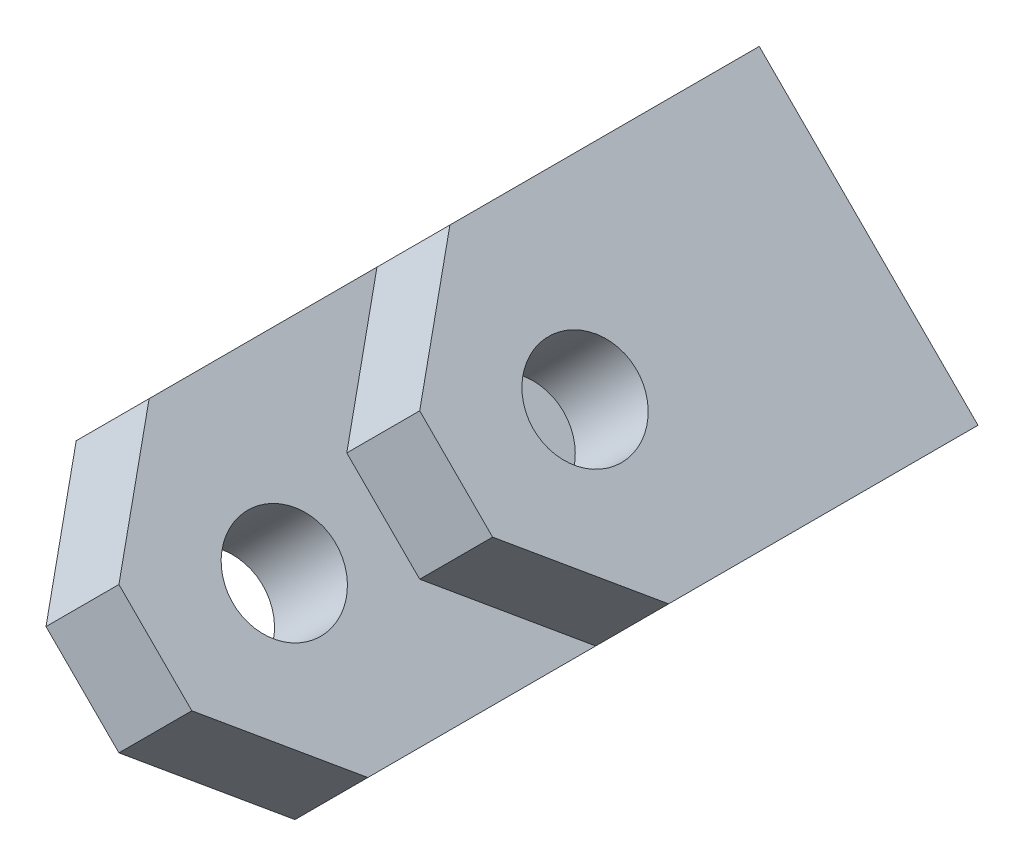
ISO-10303-21;
HEADER;
FILE_DESCRIPTION(('STEP AP214'),'2;1');
FILE_NAME('part.step','',(''),(''),'','','');
FILE_SCHEMA(('AUTOMOTIVE_DESIGN { 1 0 10303 214 1 1 1 1 }'));
ENDSEC;
DATA;
#1=APPLICATION_CONTEXT('core data for automotive mechanical design processes');
#2=APPLICATION_PROTOCOL_DEFINITION('international standard','automotive_design',2000,#1);
#3=PRODUCT_CONTEXT('',#1,'mechanical');
#4=PRODUCT('Part','Part','',(#3));
#5=PRODUCT_RELATED_PRODUCT_CATEGORY('part','',(#4));
#6=PRODUCT_DEFINITION_FORMATION('','',#4);
#7=PRODUCT_DEFINITION_CONTEXT('part definition',#1,'design');
#8=PRODUCT_DEFINITION('design','',#6,#7);
#9=PRODUCT_DEFINITION_SHAPE('','',#8);
#10=(LENGTH_UNIT() NAMED_UNIT(*) SI_UNIT(.MILLI.,.METRE.));
#11=(NAMED_UNIT(*) PLANE_ANGLE_UNIT() SI_UNIT($,.RADIAN.));
#12=(NAMED_UNIT(*) SI_UNIT($,.STERADIAN.) SOLID_ANGLE_UNIT());
#13=UNCERTAINTY_MEASURE_WITH_UNIT(LENGTH_MEASURE(1.E-05),#10,'distance_accuracy_value','');
#14=(GEOMETRIC_REPRESENTATION_CONTEXT(3) GLOBAL_UNCERTAINTY_ASSIGNED_CONTEXT((#13)) GLOBAL_UNIT_ASSIGNED_CONTEXT((#10,
#11,#12)) REPRESENTATION_CONTEXT('',''));
#15=CARTESIAN_POINT('',(0.,0.,0.));
#16=DIRECTION('',(0.,0.,1.));
#17=DIRECTION('',(1.,0.,0.));
#18=AXIS2_PLACEMENT_3D('',#15,#16,#17);
#19=CARTESIAN_POINT('',(-55.0040687415484,-1.12253201513369,101.6));
#20=DIRECTION('',(0.707106781186547,-0.707106781186548,0.));
#21=DIRECTION('',(0.707106781186548,0.707106781186547,0.));
#22=AXIS2_PLACEMENT_3D('',#19,#20,#21);
#23=PLANE('',#22);
#24=DIRECTION('',(0.,0.,-1.));
#25=VECTOR('',#24,1.);
#26=CARTESIAN_POINT('',(-72.9645809836868,-19.083044257272,101.6));
#27=LINE('',#26,#25);
#28=CARTESIAN_POINT('',(-72.9645809836865,-19.0830442572722,76.2));
#29=VERTEX_POINT('',#28);
#30=CARTESIAN_POINT('',(-72.9645809836868,-19.083044257272,0.));
#31=VERTEX_POINT('',#30);
#32=EDGE_CURVE('E123',#29,#31,#27,.T.);
#33=ORIENTED_EDGE('',*,*,#32,.F.);
#34=DIRECTION('',(-0.707106781186549,-0.707106781186546,0.));
#35=VECTOR('',#34,1.);
#36=CARTESIAN_POINT('',(46.02381262048,99.9053493468939,76.2));
#37=LINE('',#36,#35);
#38=CARTESIAN_POINT('',(-55.0040687415482,-1.12253201513392,76.2));
#39=VERTEX_POINT('',#38);
#40=EDGE_CURVE('E136',#39,#29,#37,.T.);
#41=ORIENTED_EDGE('',*,*,#40,.F.);
#42=DIRECTION('',(0.,0.,-1.));
#43=VECTOR('',#42,1.);
#44=CARTESIAN_POINT('',(-55.0040687415484,-1.12253201513369,101.6));
#45=LINE('',#44,#43);
#46=CARTESIAN_POINT('',(-55.0040687415484,-1.12253201513369,0.));
#47=VERTEX_POINT('',#46);
#48=EDGE_CURVE('E112',#39,#47,#45,.T.);
#49=ORIENTED_EDGE('',*,*,#48,.T.);
#50=DIRECTION('',(-0.707106781186548,-0.707106781186547,0.));
#51=VECTOR('',#50,1.);
#52=CARTESIAN_POINT('',(-55.0040687415484,-1.12253201513369,0.));
#53=LINE('',#52,#51);
#54=EDGE_CURVE('E127',#47,#31,#53,.T.);
#55=ORIENTED_EDGE('',*,*,#54,.T.);
#56=EDGE_LOOP('',(#33,#41,#49,#55));
#57=FACE_BOUND('',#56,.T.);
#58=ADVANCED_FACE('F43',(#57),#23,.F.);
#59=CARTESIAN_POINT('',(-72.9645809836868,-19.083044257272,101.6));
#60=DIRECTION('',(0.707106781186549,0.707106781186546,0.));
#61=DIRECTION('',(-0.707106781186546,0.707106781186549,0.));
#62=AXIS2_PLACEMENT_3D('',#59,#60,#61);
#63=PLANE('',#62);
#64=CARTESIAN_POINT('',(-46.0238126204795,-46.0238126204794,69.85));
#65=DIRECTION('',(-0.707106781186549,-0.707106781186546,0.));
#66=DIRECTION('',(0.707106781186546,-0.707106781186549,0.));
#67=AXIS2_PLACEMENT_3D('',#64,#65,#66);
#68=CIRCLE('',#67,12.7);
#69=CARTESIAN_POINT('',(-37.0435564994104,-55.0040687415485,69.85));
#70=VERTEX_POINT('',#69);
#71=EDGE_CURVE('E128',#70,#70,#68,.T.);
#72=ORIENTED_EDGE('',*,*,#71,.F.);
#73=EDGE_LOOP('',(#72));
#74=FACE_BOUND('',#73,.T.);
#75=DIRECTION('',(0.,0.,-1.));
#76=VECTOR('',#75,1.);
#77=CARTESIAN_POINT('',(-19.0830442572719,-72.964580983687,101.6));
#78=LINE('',#77,#76);
#79=CARTESIAN_POINT('',(-19.0830442572725,-72.9645809836865,76.2));
#80=VERTEX_POINT('',#79);
#81=CARTESIAN_POINT('',(-19.0830442572719,-72.964580983687,0.));
#82=VERTEX_POINT('',#81);
#83=EDGE_CURVE('E105',#80,#82,#78,.T.);
#84=ORIENTED_EDGE('',*,*,#83,.F.);
#85=DIRECTION('',(0.499999999999994,-0.499999999999996,-0.707106781186555));
#86=VECTOR('',#85,1.);
#87=CARTESIAN_POINT('',(-37.0435564994104,-55.0040687415485,101.6));
#88=LINE('',#87,#86);
#89=CARTESIAN_POINT('',(-37.0435564994104,-55.0040687415485,101.6));
#90=VERTEX_POINT('',#89);
#91=EDGE_CURVE('E94',#90,#80,#88,.T.);
#92=ORIENTED_EDGE('',*,*,#91,.F.);
#93=DIRECTION('',(0.707106781186546,-0.707106781186549,0.));
#94=VECTOR('',#93,1.);
#95=CARTESIAN_POINT('',(-72.9645809836868,-19.083044257272,101.6));
#96=LINE('',#95,#94);
#97=CARTESIAN_POINT('',(-55.0040687415486,-37.0435564994102,101.6));
#98=VERTEX_POINT('',#97);
#99=EDGE_CURVE('E103',#98,#90,#96,.T.);
#100=ORIENTED_EDGE('',*,*,#99,.F.);
#101=DIRECTION('',(0.499999999999994,-0.499999999999996,0.707106781186555));
#102=VECTOR('',#101,1.);
#103=CARTESIAN_POINT('',(-55.0040687415486,-37.0435564994102,101.6));
#104=LINE('',#103,#102);
#105=EDGE_CURVE('E64',#29,#98,#104,.T.);
#106=ORIENTED_EDGE('',*,*,#105,.F.);
#107=ORIENTED_EDGE('',*,*,#32,.T.);
#108=DIRECTION('',(0.707106781186546,-0.707106781186549,0.));
#109=VECTOR('',#108,1.);
#110=CARTESIAN_POINT('',(-72.9645809836868,-19.083044257272,0.));
#111=LINE('',#110,#109);
#112=EDGE_CURVE('E145',#31,#82,#111,.T.);
#113=ORIENTED_EDGE('',*,*,#112,.T.);
#114=EDGE_LOOP('',(#84,#92,#100,#106,#107,#113));
#115=FACE_BOUND('',#114,.T.);
#116=ADVANCED_FACE('F102',(#74,#115),#63,.F.);
#117=CARTESIAN_POINT('',(-19.0830442572719,-72.964580983687,101.6));
#118=DIRECTION('',(-0.707106781186546,0.707106781186549,0.));
#119=DIRECTION('',(-0.707106781186549,-0.707106781186546,0.));
#120=AXIS2_PLACEMENT_3D('',#117,#118,#119);
#121=PLANE('',#120);
#122=DIRECTION('',(0.,0.,-1.));
#123=VECTOR('',#122,1.);
#124=CARTESIAN_POINT('',(-1.12253201513361,-55.0040687415487,101.6));
#125=LINE('',#124,#123);
#126=CARTESIAN_POINT('',(-1.1225320151341,-55.0040687415482,76.2));
#127=VERTEX_POINT('',#126);
#128=CARTESIAN_POINT('',(-1.12253201513361,-55.0040687415487,0.));
#129=VERTEX_POINT('',#128);
#130=EDGE_CURVE('E120',#127,#129,#125,.T.);
#131=ORIENTED_EDGE('',*,*,#130,.F.);
#132=DIRECTION('',(-0.707106781186549,-0.707106781186546,0.));
#133=VECTOR('',#132,1.);
#134=CARTESIAN_POINT('',(99.905349346894,46.0238126204796,76.2));
#135=LINE('',#134,#133);
#136=EDGE_CURVE('E106',#127,#80,#135,.T.);
#137=ORIENTED_EDGE('',*,*,#136,.T.);
#138=ORIENTED_EDGE('',*,*,#83,.T.);
#139=DIRECTION('',(0.707106781186549,0.707106781186546,0.));
#140=VECTOR('',#139,1.);
#141=CARTESIAN_POINT('',(-19.0830442572719,-72.964580983687,0.));
#142=LINE('',#141,#140);
#143=EDGE_CURVE('E115',#82,#129,#142,.T.);
#144=ORIENTED_EDGE('',*,*,#143,.T.);
#145=EDGE_LOOP('',(#131,#137,#138,#144));
#146=FACE_BOUND('',#145,.T.);
#147=ADVANCED_FACE('F151',(#146),#121,.F.);
#148=CARTESIAN_POINT('',(-55.0040687415484,-1.12253201513369,101.6));
#149=DIRECTION('',(-0.707106781186549,-0.707106781186546,0.));
#150=DIRECTION('',(0.707106781186546,-0.707106781186549,0.));
#151=AXIS2_PLACEMENT_3D('',#148,#149,#150);
#152=PLANE('',#151);
#153=CARTESIAN_POINT('',(-28.0633003783412,-28.0633003783411,69.85));
#154=DIRECTION('',(-0.707106781186549,-0.707106781186546,0.));
#155=DIRECTION('',(0.707106781186546,-0.707106781186549,0.));
#156=AXIS2_PLACEMENT_3D('',#153,#154,#155);
#157=CIRCLE('',#156,12.7);
#158=CARTESIAN_POINT('',(-19.083044257272,-37.0435564994103,69.85));
#159=VERTEX_POINT('',#158);
#160=EDGE_CURVE('E125',#159,#159,#157,.T.);
#161=ORIENTED_EDGE('',*,*,#160,.T.);
#162=EDGE_LOOP('',(#161));
#163=FACE_BOUND('',#162,.T.);
#164=DIRECTION('',(-0.707106781186546,0.707106781186549,0.));
#165=VECTOR('',#164,1.);
#166=CARTESIAN_POINT('',(-55.0040687415484,-1.12253201513369,101.6));
#167=LINE('',#166,#165);
#168=CARTESIAN_POINT('',(-19.083044257272,-37.0435564994102,101.6));
#169=VERTEX_POINT('',#168);
#170=CARTESIAN_POINT('',(-37.0435564994103,-19.0830442572719,101.6));
#171=VERTEX_POINT('',#170);
#172=EDGE_CURVE('E109',#169,#171,#167,.T.);
#173=ORIENTED_EDGE('',*,*,#172,.F.);
#174=DIRECTION('',(0.499999999999994,-0.499999999999996,-0.707106781186555));
#175=VECTOR('',#174,1.);
#176=CARTESIAN_POINT('',(-37.0435564994099,-19.0830442572723,127.));
#177=LINE('',#176,#175);
#178=EDGE_CURVE('E56',#169,#127,#177,.T.);
#179=ORIENTED_EDGE('',*,*,#178,.T.);
#180=ORIENTED_EDGE('',*,*,#130,.T.);
#181=DIRECTION('',(-0.707106781186546,0.707106781186549,0.));
#182=VECTOR('',#181,1.);
#183=CARTESIAN_POINT('',(-55.0040687415484,-1.12253201513369,0.));
#184=LINE('',#183,#182);
#185=EDGE_CURVE('E110',#129,#47,#184,.T.);
#186=ORIENTED_EDGE('',*,*,#185,.T.);
#187=ORIENTED_EDGE('',*,*,#48,.F.);
#188=DIRECTION('',(0.499999999999994,-0.499999999999996,0.707106781186555));
#189=VECTOR('',#188,1.);
#190=CARTESIAN_POINT('',(-46.0238126204792,-10.102788136203,88.9000000000001));
#191=LINE('',#190,#189);
#192=EDGE_CURVE('E131',#39,#171,#191,.T.);
#193=ORIENTED_EDGE('',*,*,#192,.T.);
#194=EDGE_LOOP('',(#173,#179,#180,#186,#187,#193));
#195=FACE_BOUND('',#194,.T.);
#196=ADVANCED_FACE('F135',(#163,#195),#152,.F.);
#197=CARTESIAN_POINT('',(-72.9645809836868,-19.083044257272,101.6));
#198=DIRECTION('',(0.,0.,1.));
#199=DIRECTION('',(1.,0.,0.));
#200=AXIS2_PLACEMENT_3D('',#197,#198,#199);
#201=PLANE('',#200);
#202=DIRECTION('',(-0.707106781186549,-0.707106781186546,0.));
#203=VECTOR('',#202,1.);
#204=CARTESIAN_POINT('',(-37.0435564994104,-55.0040687415485,101.6));
#205=LINE('',#204,#203);
#206=EDGE_CURVE('E12',#169,#90,#205,.T.);
#207=ORIENTED_EDGE('',*,*,#206,.F.);
#208=ORIENTED_EDGE('',*,*,#172,.T.);
#209=DIRECTION('',(0.707106781186549,0.707106781186546,0.));
#210=VECTOR('',#209,1.);
#211=CARTESIAN_POINT('',(-55.0040687415486,-37.0435564994102,101.6));
#212=LINE('',#211,#210);
#213=EDGE_CURVE('E50',#98,#171,#212,.T.);
#214=ORIENTED_EDGE('',*,*,#213,.F.);
#215=ORIENTED_EDGE('',*,*,#99,.T.);
#216=EDGE_LOOP('',(#207,#208,#214,#215));
#217=FACE_BOUND('',#216,.T.);
#218=ADVANCED_FACE('F108',(#217),#201,.T.);
#219=CARTESIAN_POINT('',(-72.9645809836868,-19.083044257272,0.));
#220=DIRECTION('',(0.,0.,1.));
#221=DIRECTION('',(1.,0.,0.));
#222=AXIS2_PLACEMENT_3D('',#219,#220,#221);
#223=PLANE('',#222);
#224=ORIENTED_EDGE('',*,*,#54,.F.);
#225=ORIENTED_EDGE('',*,*,#185,.F.);
#226=ORIENTED_EDGE('',*,*,#143,.F.);
#227=ORIENTED_EDGE('',*,*,#112,.F.);
#228=EDGE_LOOP('',(#224,#225,#226,#227));
#229=FACE_BOUND('',#228,.T.);
#230=ADVANCED_FACE('F155',(#229),#223,.F.);
#231=CARTESIAN_POINT('',(72.964580983687,72.9645809836867,69.85));
#232=DIRECTION('',(-0.707106781186549,-0.707106781186546,0.));
#233=DIRECTION('',(0.707106781186546,-0.707106781186549,0.));
#234=AXIS2_PLACEMENT_3D('',#231,#232,#233);
#235=CYLINDRICAL_SURFACE('',#234,12.7);
#236=ORIENTED_EDGE('',*,*,#71,.T.);
#237=EDGE_LOOP('',(#236));
#238=FACE_BOUND('',#237,.T.);
#239=ORIENTED_EDGE('',*,*,#160,.F.);
#240=EDGE_LOOP('',(#239));
#241=FACE_BOUND('',#240,.T.);
#242=ADVANCED_FACE('F176',(#238,#241),#235,.F.);
#243=CARTESIAN_POINT('',(63.9843248626179,81.9448371047559,101.6));
#244=DIRECTION('',(0.500000000000004,-0.500000000000006,-0.70710678118654));
#245=DIRECTION('',(0.,0.81649658092772,-0.577350269189635));
#246=AXIS2_PLACEMENT_3D('',#243,#244,#245);
#247=PLANE('',#246);
#248=ORIENTED_EDGE('',*,*,#40,.T.);
#249=ORIENTED_EDGE('',*,*,#105,.T.);
#250=ORIENTED_EDGE('',*,*,#213,.T.);
#251=ORIENTED_EDGE('',*,*,#192,.F.);
#252=EDGE_LOOP('',(#248,#249,#250,#251));
#253=FACE_BOUND('',#252,.T.);
#254=ADVANCED_FACE('F130',(#253),#247,.F.);
#255=CARTESIAN_POINT('',(81.9448371047561,63.9843248626176,101.6));
#256=DIRECTION('',(-0.500000000000004,0.500000000000006,-0.70710678118654));
#257=DIRECTION('',(0.,0.81649658092772,0.577350269189634));
#258=AXIS2_PLACEMENT_3D('',#255,#256,#257);
#259=PLANE('',#258);
#260=ORIENTED_EDGE('',*,*,#206,.T.);
#261=ORIENTED_EDGE('',*,*,#91,.T.);
#262=ORIENTED_EDGE('',*,*,#136,.F.);
#263=ORIENTED_EDGE('',*,*,#178,.F.);
#264=EDGE_LOOP('',(#260,#261,#262,#263));
#265=FACE_BOUND('',#264,.T.);
#266=ADVANCED_FACE('F93',(#265),#259,.F.);
#267=CLOSED_SHELL('',(#58,#116,#147,#196,#218,#230,#242,#254,#266));
#268=MANIFOLD_SOLID_BREP('B2',#267);
#269=CARTESIAN_POINT('',(72.964580983687,19.0830442572717,101.6));
#270=DIRECTION('',(-0.707106781186546,0.707106781186549,0.));
#271=DIRECTION('',(-0.707106781186549,-0.707106781186546,0.));
#272=AXIS2_PLACEMENT_3D('',#269,#270,#271);
#273=PLANE('',#272);
#274=DIRECTION('',(0.,0.,-1.));
#275=VECTOR('',#274,1.);
#276=CARTESIAN_POINT('',(72.964580983687,19.0830442572717,101.6));
#277=LINE('',#276,#275);
#278=CARTESIAN_POINT('',(72.9645809836865,19.0830442572722,76.2));
#279=VERTEX_POINT('',#278);
#280=CARTESIAN_POINT('',(72.964580983687,19.0830442572717,0.));
#281=VERTEX_POINT('',#280);
#282=EDGE_CURVE('E307',#279,#281,#277,.T.);
#283=ORIENTED_EDGE('',*,*,#282,.F.);
#284=DIRECTION('',(-0.707106781186549,-0.707106781186546,0.));
#285=VECTOR('',#284,1.);
#286=CARTESIAN_POINT('',(99.905349346894,46.0238126204796,76.2));
#287=LINE('',#286,#285);
#288=CARTESIAN_POINT('',(55.0040687415482,1.12253201513391,76.2));
#289=VERTEX_POINT('',#288);
#290=EDGE_CURVE('E293',#279,#289,#287,.T.);
#291=ORIENTED_EDGE('',*,*,#290,.T.);
#292=DIRECTION('',(0.,0.,-1.));
#293=VECTOR('',#292,1.);
#294=CARTESIAN_POINT('',(55.0040687415487,1.12253201513342,101.6));
#295=LINE('',#294,#293);
#296=CARTESIAN_POINT('',(55.0040687415487,1.12253201513342,0.));
#297=VERTEX_POINT('',#296);
#298=EDGE_CURVE('E292',#289,#297,#295,.T.);
#299=ORIENTED_EDGE('',*,*,#298,.T.);
#300=DIRECTION('',(0.707106781186549,0.707106781186546,0.));
#301=VECTOR('',#300,1.);
#302=CARTESIAN_POINT('',(72.964580983687,19.0830442572717,0.));
#303=LINE('',#302,#301);
#304=EDGE_CURVE('E327',#297,#281,#303,.T.);
#305=ORIENTED_EDGE('',*,*,#304,.T.);
#306=EDGE_LOOP('',(#283,#291,#299,#305));
#307=FACE_BOUND('',#306,.T.);
#308=ADVANCED_FACE('F230',(#307),#273,.F.);
#309=CARTESIAN_POINT('',(19.0830442572722,72.9645809836867,101.6));
#310=DIRECTION('',(-0.707106781186549,-0.707106781186546,0.));
#311=DIRECTION('',(0.707106781186546,-0.707106781186549,0.));
#312=AXIS2_PLACEMENT_3D('',#309,#310,#311);
#313=PLANE('',#312);
#314=CARTESIAN_POINT('',(46.0238126204795,46.0238126204793,69.85));
#315=DIRECTION('',(-0.707106781186549,-0.707106781186546,0.));
#316=DIRECTION('',(0.707106781186546,-0.707106781186549,0.));
#317=AXIS2_PLACEMENT_3D('',#314,#315,#316);
#318=CIRCLE('',#317,12.7);
#319=CARTESIAN_POINT('',(55.0040687415486,37.0435564994102,69.85));
#320=VERTEX_POINT('',#319);
#321=EDGE_CURVE('E311',#320,#320,#318,.T.);
#322=ORIENTED_EDGE('',*,*,#321,.T.);
#323=EDGE_LOOP('',(#322));
#324=FACE_BOUND('',#323,.T.);
#325=DIRECTION('',(-0.707106781186546,0.707106781186549,0.));
#326=VECTOR('',#325,1.);
#327=CARTESIAN_POINT('',(19.0830442572722,72.9645809836867,101.6));
#328=LINE('',#327,#326);
#329=CARTESIAN_POINT('',(55.0040687415486,37.0435564994102,101.6));
#330=VERTEX_POINT('',#329);
#331=CARTESIAN_POINT('',(37.0435564994104,55.0040687415485,101.6));
#332=VERTEX_POINT('',#331);
#333=EDGE_CURVE('E296',#330,#332,#328,.T.);
#334=ORIENTED_EDGE('',*,*,#333,.F.);
#335=DIRECTION('',(0.499999999999994,-0.499999999999996,-0.707106781186555));
#336=VECTOR('',#335,1.);
#337=CARTESIAN_POINT('',(37.0435564994108,55.0040687415481,127.));
#338=LINE('',#337,#336);
#339=EDGE_CURVE('E243',#330,#279,#338,.T.);
#340=ORIENTED_EDGE('',*,*,#339,.T.);
#341=ORIENTED_EDGE('',*,*,#282,.T.);
#342=DIRECTION('',(-0.707106781186546,0.707106781186549,0.));
#343=VECTOR('',#342,1.);
#344=CARTESIAN_POINT('',(19.0830442572722,72.9645809836867,0.));
#345=LINE('',#344,#343);
#346=CARTESIAN_POINT('',(19.0830442572722,72.9645809836867,0.));
#347=VERTEX_POINT('',#346);
#348=EDGE_CURVE('E330',#281,#347,#345,.T.);
#349=ORIENTED_EDGE('',*,*,#348,.T.);
#350=DIRECTION('',(0.,0.,-1.));
#351=VECTOR('',#350,1.);
#352=CARTESIAN_POINT('',(19.0830442572722,72.9645809836867,101.6));
#353=LINE('',#352,#351);
#354=CARTESIAN_POINT('',(19.0830442572725,72.9645809836865,76.2));
#355=VERTEX_POINT('',#354);
#356=EDGE_CURVE('E305',#355,#347,#353,.T.);
#357=ORIENTED_EDGE('',*,*,#356,.F.);
#358=DIRECTION('',(0.499999999999994,-0.499999999999996,0.707106781186555));
#359=VECTOR('',#358,1.);
#360=CARTESIAN_POINT('',(28.0633003783415,63.9843248626174,88.9000000000001));
#361=LINE('',#360,#359);
#362=EDGE_CURVE('E312',#355,#332,#361,.T.);
#363=ORIENTED_EDGE('',*,*,#362,.T.);
#364=EDGE_LOOP('',(#334,#340,#341,#349,#357,#363));
#365=FACE_BOUND('',#364,.T.);
#366=ADVANCED_FACE('F318',(#324,#365),#313,.F.);
#367=CARTESIAN_POINT('',(1.12253201513387,55.0040687415484,101.6));
#368=DIRECTION('',(0.707106781186547,-0.707106781186548,0.));
#369=DIRECTION('',(0.707106781186548,0.707106781186547,0.));
#370=AXIS2_PLACEMENT_3D('',#367,#368,#369);
#371=PLANE('',#370);
#372=DIRECTION('',(0.,0.,-1.));
#373=VECTOR('',#372,1.);
#374=CARTESIAN_POINT('',(1.12253201513387,55.0040687415484,101.6));
#375=LINE('',#374,#373);
#376=CARTESIAN_POINT('',(1.12253201513412,55.0040687415482,76.2));
#377=VERTEX_POINT('',#376);
#378=CARTESIAN_POINT('',(1.12253201513387,55.0040687415484,0.));
#379=VERTEX_POINT('',#378);
#380=EDGE_CURVE('E298',#377,#379,#375,.T.);
#381=ORIENTED_EDGE('',*,*,#380,.F.);
#382=DIRECTION('',(-0.707106781186549,-0.707106781186546,0.));
#383=VECTOR('',#382,1.);
#384=CARTESIAN_POINT('',(46.02381262048,99.9053493468939,76.2));
#385=LINE('',#384,#383);
#386=EDGE_CURVE('E321',#355,#377,#385,.T.);
#387=ORIENTED_EDGE('',*,*,#386,.F.);
#388=ORIENTED_EDGE('',*,*,#356,.T.);
#389=DIRECTION('',(-0.707106781186548,-0.707106781186547,0.));
#390=VECTOR('',#389,1.);
#391=CARTESIAN_POINT('',(1.12253201513387,55.0040687415484,0.));
#392=LINE('',#391,#390);
#393=EDGE_CURVE('E332',#347,#379,#392,.T.);
#394=ORIENTED_EDGE('',*,*,#393,.T.);
#395=EDGE_LOOP('',(#381,#387,#388,#394));
#396=FACE_BOUND('',#395,.T.);
#397=ADVANCED_FACE('F346',(#396),#371,.F.);
#398=CARTESIAN_POINT('',(1.12253201513387,55.0040687415484,101.6));
#399=DIRECTION('',(0.707106781186549,0.707106781186546,0.));
#400=DIRECTION('',(-0.707106781186546,0.707106781186549,0.));
#401=AXIS2_PLACEMENT_3D('',#398,#399,#400);
#402=PLANE('',#401);
#403=CARTESIAN_POINT('',(28.0633003783412,28.063300378341,69.85));
#404=DIRECTION('',(0.707106781186549,0.707106781186546,0.));
#405=DIRECTION('',(-0.707106781186546,0.707106781186549,0.));
#406=AXIS2_PLACEMENT_3D('',#403,#404,#405);
#407=CIRCLE('',#406,12.7);
#408=CARTESIAN_POINT('',(19.083044257272,37.0435564994102,69.85));
#409=VERTEX_POINT('',#408);
#410=EDGE_CURVE('E309',#409,#409,#407,.T.);
#411=ORIENTED_EDGE('',*,*,#410,.T.);
#412=EDGE_LOOP('',(#411));
#413=FACE_BOUND('',#412,.T.);
#414=ORIENTED_EDGE('',*,*,#298,.F.);
#415=DIRECTION('',(-0.499999999999994,0.499999999999996,0.707106781186555));
#416=VECTOR('',#415,1.);
#417=CARTESIAN_POINT('',(19.0830442572725,37.0435564994098,127.));
#418=LINE('',#417,#416);
#419=CARTESIAN_POINT('',(37.0435564994103,19.0830442572719,101.6));
#420=VERTEX_POINT('',#419);
#421=EDGE_CURVE('E281',#289,#420,#418,.T.);
#422=ORIENTED_EDGE('',*,*,#421,.T.);
#423=DIRECTION('',(0.707106781186546,-0.707106781186549,0.));
#424=VECTOR('',#423,1.);
#425=CARTESIAN_POINT('',(1.12253201513387,55.0040687415484,101.6));
#426=LINE('',#425,#424);
#427=CARTESIAN_POINT('',(19.083044257272,37.0435564994102,101.6));
#428=VERTEX_POINT('',#427);
#429=EDGE_CURVE('E290',#428,#420,#426,.T.);
#430=ORIENTED_EDGE('',*,*,#429,.F.);
#431=DIRECTION('',(-0.499999999999994,0.499999999999996,-0.707106781186555));
#432=VECTOR('',#431,1.);
#433=CARTESIAN_POINT('',(10.1027881362031,46.0238126204791,88.9000000000001));
#434=LINE('',#433,#432);
#435=EDGE_CURVE('E251',#428,#377,#434,.T.);
#436=ORIENTED_EDGE('',*,*,#435,.T.);
#437=ORIENTED_EDGE('',*,*,#380,.T.);
#438=DIRECTION('',(0.707106781186546,-0.707106781186549,0.));
#439=VECTOR('',#438,1.);
#440=CARTESIAN_POINT('',(1.12253201513387,55.0040687415484,0.));
#441=LINE('',#440,#439);
#442=EDGE_CURVE('E300',#379,#297,#441,.T.);
#443=ORIENTED_EDGE('',*,*,#442,.T.);
#444=EDGE_LOOP('',(#414,#422,#430,#436,#437,#443));
#445=FACE_BOUND('',#444,.T.);
#446=ADVANCED_FACE('F289',(#413,#445),#402,.F.);
#447=CARTESIAN_POINT('',(55.0040687415487,1.12253201513342,101.6));
#448=DIRECTION('',(0.,0.,1.));
#449=DIRECTION('',(1.,0.,0.));
#450=AXIS2_PLACEMENT_3D('',#447,#448,#449);
#451=PLANE('',#450);
#452=DIRECTION('',(-0.707106781186549,-0.707106781186546,0.));
#453=VECTOR('',#452,1.);
#454=CARTESIAN_POINT('',(37.0435564994103,19.0830442572719,101.6));
#455=LINE('',#454,#453);
#456=EDGE_CURVE('E41',#330,#420,#455,.T.);
#457=ORIENTED_EDGE('',*,*,#456,.F.);
#458=ORIENTED_EDGE('',*,*,#333,.T.);
#459=DIRECTION('',(0.707106781186549,0.707106781186546,0.));
#460=VECTOR('',#459,1.);
#461=CARTESIAN_POINT('',(19.083044257272,37.0435564994102,101.6));
#462=LINE('',#461,#460);
#463=EDGE_CURVE('E237',#428,#332,#462,.T.);
#464=ORIENTED_EDGE('',*,*,#463,.F.);
#465=ORIENTED_EDGE('',*,*,#429,.T.);
#466=EDGE_LOOP('',(#457,#458,#464,#465));
#467=FACE_BOUND('',#466,.T.);
#468=ADVANCED_FACE('F295',(#467),#451,.T.);
#469=CARTESIAN_POINT('',(55.0040687415487,1.12253201513342,0.));
#470=DIRECTION('',(0.,0.,1.));
#471=DIRECTION('',(1.,0.,0.));
#472=AXIS2_PLACEMENT_3D('',#469,#470,#471);
#473=PLANE('',#472);
#474=ORIENTED_EDGE('',*,*,#304,.F.);
#475=ORIENTED_EDGE('',*,*,#442,.F.);
#476=ORIENTED_EDGE('',*,*,#393,.F.);
#477=ORIENTED_EDGE('',*,*,#348,.F.);
#478=EDGE_LOOP('',(#474,#475,#476,#477));
#479=FACE_BOUND('',#478,.T.);
#480=ADVANCED_FACE('F340',(#479),#473,.F.);
#481=CARTESIAN_POINT('',(72.964580983687,72.9645809836867,69.85));
#482=DIRECTION('',(-0.707106781186549,-0.707106781186546,0.));
#483=DIRECTION('',(0.707106781186546,-0.707106781186549,0.));
#484=AXIS2_PLACEMENT_3D('',#481,#482,#483);
#485=CYLINDRICAL_SURFACE('',#484,12.7);
#486=ORIENTED_EDGE('',*,*,#410,.F.);
#487=EDGE_LOOP('',(#486));
#488=FACE_BOUND('',#487,.T.);
#489=ORIENTED_EDGE('',*,*,#321,.F.);
#490=EDGE_LOOP('',(#489));
#491=FACE_BOUND('',#490,.T.);
#492=ADVANCED_FACE('F384',(#488,#491),#485,.F.);
#493=CARTESIAN_POINT('',(63.9843248626179,81.9448371047559,101.6));
#494=DIRECTION('',(0.500000000000004,-0.500000000000006,-0.70710678118654));
#495=DIRECTION('',(0.,0.81649658092772,-0.577350269189635));
#496=AXIS2_PLACEMENT_3D('',#493,#494,#495);
#497=PLANE('',#496);
#498=ORIENTED_EDGE('',*,*,#386,.T.);
#499=ORIENTED_EDGE('',*,*,#435,.F.);
#500=ORIENTED_EDGE('',*,*,#463,.T.);
#501=ORIENTED_EDGE('',*,*,#362,.F.);
#502=EDGE_LOOP('',(#498,#499,#500,#501));
#503=FACE_BOUND('',#502,.T.);
#504=ADVANCED_FACE('F314',(#503),#497,.F.);
#505=CARTESIAN_POINT('',(81.9448371047561,63.9843248626176,101.6));
#506=DIRECTION('',(-0.500000000000004,0.500000000000006,-0.70710678118654));
#507=DIRECTION('',(0.,0.81649658092772,0.577350269189634));
#508=AXIS2_PLACEMENT_3D('',#505,#506,#507);
#509=PLANE('',#508);
#510=ORIENTED_EDGE('',*,*,#456,.T.);
#511=ORIENTED_EDGE('',*,*,#421,.F.);
#512=ORIENTED_EDGE('',*,*,#290,.F.);
#513=ORIENTED_EDGE('',*,*,#339,.F.);
#514=EDGE_LOOP('',(#510,#511,#512,#513));
#515=FACE_BOUND('',#514,.T.);
#516=ADVANCED_FACE('F280',(#515),#509,.F.);
#517=CLOSED_SHELL('',(#308,#366,#397,#446,#468,#480,#492,#504,#516));
#518=MANIFOLD_SOLID_BREP('B6',#517);
#519=ADVANCED_BREP_SHAPE_REPRESENTATION('',(#18,#268,#518),#14);
#520=SHAPE_DEFINITION_REPRESENTATION(#9,#519);
ENDSEC;
END-ISO-10303-21;
